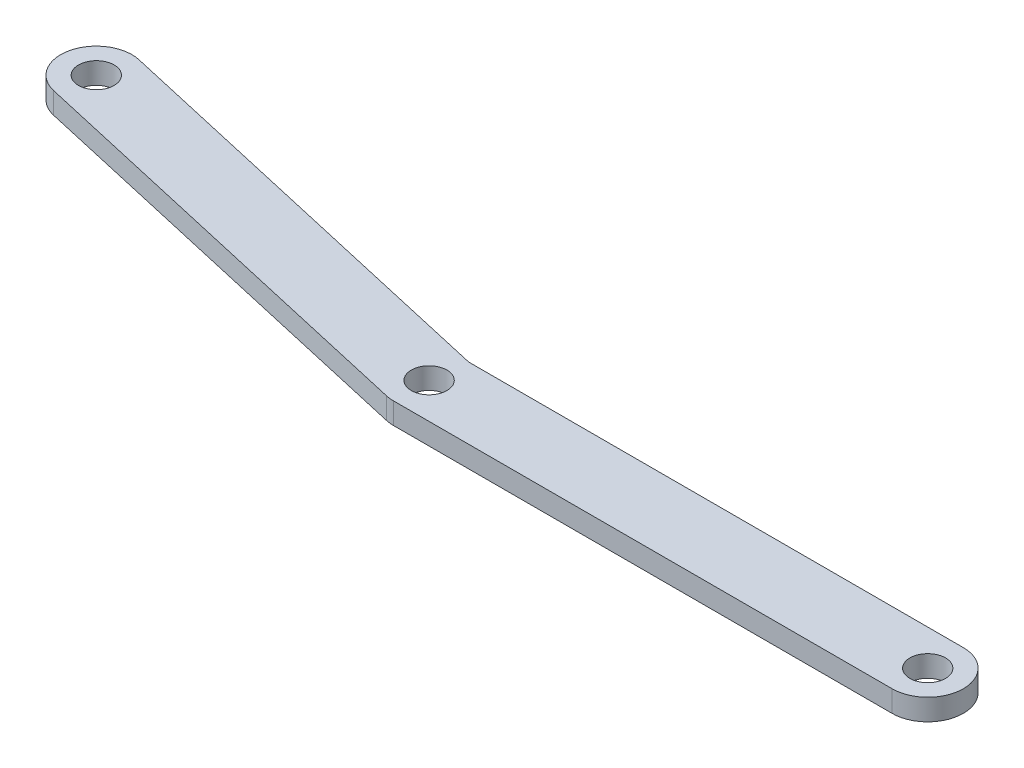
ISO-10303-21;
HEADER;
FILE_DESCRIPTION(('STEP AP214'),'2;1');
FILE_NAME('part.step','',(''),(''),'','','');
FILE_SCHEMA(('AUTOMOTIVE_DESIGN { 1 0 10303 214 1 1 1 1 }'));
ENDSEC;
DATA;
#1=APPLICATION_CONTEXT('core data for automotive mechanical design processes');
#2=APPLICATION_PROTOCOL_DEFINITION('international standard','automotive_design',2000,#1);
#3=PRODUCT_CONTEXT('',#1,'mechanical');
#4=PRODUCT('Part','Part','',(#3));
#5=PRODUCT_RELATED_PRODUCT_CATEGORY('part','',(#4));
#6=PRODUCT_DEFINITION_FORMATION('','',#4);
#7=PRODUCT_DEFINITION_CONTEXT('part definition',#1,'design');
#8=PRODUCT_DEFINITION('design','',#6,#7);
#9=PRODUCT_DEFINITION_SHAPE('','',#8);
#10=(LENGTH_UNIT() NAMED_UNIT(*) SI_UNIT(.MILLI.,.METRE.));
#11=(NAMED_UNIT(*) PLANE_ANGLE_UNIT() SI_UNIT($,.RADIAN.));
#12=(NAMED_UNIT(*) SI_UNIT($,.STERADIAN.) SOLID_ANGLE_UNIT());
#13=UNCERTAINTY_MEASURE_WITH_UNIT(LENGTH_MEASURE(1.E-05),#10,'distance_accuracy_value','');
#14=(GEOMETRIC_REPRESENTATION_CONTEXT(3) GLOBAL_UNCERTAINTY_ASSIGNED_CONTEXT((#13)) GLOBAL_UNIT_ASSIGNED_CONTEXT((#10,
#11,#12)) REPRESENTATION_CONTEXT('',''));
#15=CARTESIAN_POINT('',(0.,0.,0.));
#16=DIRECTION('',(0.,0.,1.));
#17=DIRECTION('',(1.,0.,0.));
#18=AXIS2_PLACEMENT_3D('',#15,#16,#17);
#19=CARTESIAN_POINT('',(-44.45,3.81,0.));
#20=DIRECTION('',(0.,-1.,0.));
#21=DIRECTION('',(0.,0.,-1.));
#22=AXIS2_PLACEMENT_3D('',#19,#20,#21);
#23=CYLINDRICAL_SURFACE('',#22,6.35);
#24=DIRECTION('',(0.,-1.,0.));
#25=VECTOR('',#24,1.);
#26=CARTESIAN_POINT('',(-44.45,3.81,6.35));
#27=LINE('',#26,#25);
#28=CARTESIAN_POINT('',(-44.45,3.81,6.35));
#29=VERTEX_POINT('',#28);
#30=CARTESIAN_POINT('',(-44.45,0.,6.35));
#31=VERTEX_POINT('',#30);
#32=EDGE_CURVE('E54',#29,#31,#27,.T.);
#33=ORIENTED_EDGE('',*,*,#32,.F.);
#34=CARTESIAN_POINT('',(-44.45,3.81,0.));
#35=DIRECTION('',(0.,1.,0.));
#36=DIRECTION('',(0.,0.,1.));
#37=AXIS2_PLACEMENT_3D('',#34,#35,#36);
#38=CIRCLE('',#37,6.35);
#39=CARTESIAN_POINT('',(-45.8568329598836,3.81,6.19219839984034));
#40=VERTEX_POINT('',#39);
#41=EDGE_CURVE('E118',#40,#29,#38,.T.);
#42=ORIENTED_EDGE('',*,*,#41,.F.);
#43=DIRECTION('',(0.,-1.,0.));
#44=VECTOR('',#43,1.);
#45=CARTESIAN_POINT('',(-45.8568329598836,3.81,6.19219839984034));
#46=LINE('',#45,#44);
#47=CARTESIAN_POINT('',(-45.8568329598836,0.,6.19219839984034));
#48=VERTEX_POINT('',#47);
#49=EDGE_CURVE('E143',#40,#48,#46,.T.);
#50=ORIENTED_EDGE('',*,*,#49,.T.);
#51=CARTESIAN_POINT('',(-44.45,0.,0.));
#52=DIRECTION('',(0.,1.,0.));
#53=DIRECTION('',(0.,0.,1.));
#54=AXIS2_PLACEMENT_3D('',#51,#52,#53);
#55=CIRCLE('',#54,6.35);
#56=EDGE_CURVE('E135',#48,#31,#55,.T.);
#57=ORIENTED_EDGE('',*,*,#56,.T.);
#58=EDGE_LOOP('',(#33,#42,#50,#57));
#59=FACE_BOUND('',#58,.T.);
#60=ADVANCED_FACE('F39',(#59),#23,.T.);
#61=CARTESIAN_POINT('',(-0.774939140762644,3.81,3.41090736728346));
#62=DIRECTION('',(-0.221548497619461,0.,0.975149354305565));
#63=DIRECTION('',(0.975149354305565,0.,0.221548497619461));
#64=AXIS2_PLACEMENT_3D('',#61,#62,#63);
#65=PLANE('',#64);
#66=DIRECTION('',(-0.975149354305565,0.,-0.221548497619461));
#67=VECTOR('',#66,1.);
#68=CARTESIAN_POINT('',(-0.774939140762644,3.81,3.41090736728346));
#69=LINE('',#68,#67);
#70=CARTESIAN_POINT('',(-43.7377333773181,3.81,-6.35));
#71=VERTEX_POINT('',#70);
#72=CARTESIAN_POINT('',(-119.826427198137,3.81,-23.6369271023967));
#73=VERTEX_POINT('',#72);
#74=EDGE_CURVE('E62',#71,#73,#69,.T.);
#75=ORIENTED_EDGE('',*,*,#74,.F.);
#76=DIRECTION('',(0.,-1.,0.));
#77=VECTOR('',#76,1.);
#78=CARTESIAN_POINT('',(-43.7377333773181,3.81,-6.35));
#79=LINE('',#78,#77);
#80=CARTESIAN_POINT('',(-43.7377333773181,0.,-6.35));
#81=VERTEX_POINT('',#80);
#82=EDGE_CURVE('E125',#71,#81,#79,.T.);
#83=ORIENTED_EDGE('',*,*,#82,.T.);
#84=DIRECTION('',(-0.975149354305565,0.,-0.221548497619461));
#85=VECTOR('',#84,1.);
#86=CARTESIAN_POINT('',(-0.774939140762644,0.,3.41090736728346));
#87=LINE('',#86,#85);
#88=CARTESIAN_POINT('',(-119.826427198137,0.,-23.6369271023967));
#89=VERTEX_POINT('',#88);
#90=EDGE_CURVE('E146',#81,#89,#87,.T.);
#91=ORIENTED_EDGE('',*,*,#90,.T.);
#92=DIRECTION('',(0.,-1.,0.));
#93=VECTOR('',#92,1.);
#94=CARTESIAN_POINT('',(-119.826427198137,3.81,-23.6369271023967));
#95=LINE('',#94,#93);
#96=EDGE_CURVE('E11',#73,#89,#95,.T.);
#97=ORIENTED_EDGE('',*,*,#96,.F.);
#98=EDGE_LOOP('',(#75,#83,#91,#97));
#99=FACE_BOUND('',#98,.T.);
#100=ADVANCED_FACE('F200',(#99),#65,.F.);
#101=CARTESIAN_POINT('',(-121.23326015802,3.81,-17.4447287025564));
#102=DIRECTION('',(0.,-1.,0.));
#103=DIRECTION('',(0.,0.,-1.));
#104=AXIS2_PLACEMENT_3D('',#101,#102,#103);
#105=CYLINDRICAL_SURFACE('',#104,6.35);
#106=CARTESIAN_POINT('',(-121.23326015802,0.,-17.4447287025564));
#107=DIRECTION('',(0.,1.,0.));
#108=DIRECTION('',(0.,0.,1.));
#109=AXIS2_PLACEMENT_3D('',#106,#107,#108);
#110=CIRCLE('',#109,6.35);
#111=CARTESIAN_POINT('',(-122.640093117904,0.,-11.252530302716));
#112=VERTEX_POINT('',#111);
#113=EDGE_CURVE('E148',#89,#112,#110,.T.);
#114=ORIENTED_EDGE('',*,*,#113,.T.);
#115=DIRECTION('',(0.,-1.,0.));
#116=VECTOR('',#115,1.);
#117=CARTESIAN_POINT('',(-122.640093117904,3.81,-11.252530302716));
#118=LINE('',#117,#116);
#119=CARTESIAN_POINT('',(-122.640093117904,3.81,-11.252530302716));
#120=VERTEX_POINT('',#119);
#121=EDGE_CURVE('E47',#120,#112,#118,.T.);
#122=ORIENTED_EDGE('',*,*,#121,.F.);
#123=CARTESIAN_POINT('',(-121.23326015802,3.81,-17.4447287025564));
#124=DIRECTION('',(0.,1.,0.));
#125=DIRECTION('',(0.,0.,1.));
#126=AXIS2_PLACEMENT_3D('',#123,#124,#125);
#127=CIRCLE('',#126,6.35);
#128=EDGE_CURVE('E137',#73,#120,#127,.T.);
#129=ORIENTED_EDGE('',*,*,#128,.F.);
#130=ORIENTED_EDGE('',*,*,#96,.T.);
#131=EDGE_LOOP('',(#114,#122,#129,#130));
#132=FACE_BOUND('',#131,.T.);
#133=ADVANCED_FACE('F162',(#132),#105,.T.);
#134=CARTESIAN_POINT('',(-3.5886050605298,3.81,15.7953041669641));
#135=DIRECTION('',(-0.221548497619461,0.,0.975149354305565));
#136=DIRECTION('',(0.975149354305565,0.,0.221548497619461));
#137=AXIS2_PLACEMENT_3D('',#134,#135,#136);
#138=PLANE('',#137);
#139=DIRECTION('',(-0.975149354305565,0.,-0.221548497619461));
#140=VECTOR('',#139,1.);
#141=CARTESIAN_POINT('',(-3.5886050605298,0.,15.7953041669641));
#142=LINE('',#141,#140);
#143=EDGE_CURVE('E151',#48,#112,#142,.T.);
#144=ORIENTED_EDGE('',*,*,#143,.F.);
#145=ORIENTED_EDGE('',*,*,#49,.F.);
#146=DIRECTION('',(-0.975149354305565,0.,-0.221548497619461));
#147=VECTOR('',#146,1.);
#148=CARTESIAN_POINT('',(-3.5886050605298,3.81,15.7953041669641));
#149=LINE('',#148,#147);
#150=EDGE_CURVE('E139',#40,#120,#149,.T.);
#151=ORIENTED_EDGE('',*,*,#150,.T.);
#152=ORIENTED_EDGE('',*,*,#121,.T.);
#153=EDGE_LOOP('',(#144,#145,#151,#152));
#154=FACE_BOUND('',#153,.T.);
#155=ADVANCED_FACE('F158',(#154),#138,.T.);
#156=CARTESIAN_POINT('',(-121.23326015802,3.81,-17.4447287025564));
#157=DIRECTION('',(0.,-1.,0.));
#158=DIRECTION('',(0.,0.,-1.));
#159=AXIS2_PLACEMENT_3D('',#156,#157,#158);
#160=CYLINDRICAL_SURFACE('',#159,3.175);
#161=CARTESIAN_POINT('',(-121.23326015802,3.81,-17.4447287025564));
#162=DIRECTION('',(0.,1.,0.));
#163=DIRECTION('',(0.,0.,1.));
#164=AXIS2_PLACEMENT_3D('',#161,#162,#163);
#165=CIRCLE('',#164,3.175);
#166=CARTESIAN_POINT('',(-121.23326015802,3.81,-20.6197287025564));
#167=VERTEX_POINT('',#166);
#168=EDGE_CURVE('E132',#167,#167,#165,.T.);
#169=CARTESIAN_POINT('',(-121.23326015802,0.,-17.4447287025564));
#170=DIRECTION('',(0.,1.,0.));
#171=DIRECTION('',(0.,0.,1.));
#172=AXIS2_PLACEMENT_3D('',#169,#170,#171);
#173=CIRCLE('',#172,3.175);
#174=CARTESIAN_POINT('',(-121.23326015802,0.,-20.6197287025564));
#175=VERTEX_POINT('',#174);
#176=EDGE_CURVE('E127',#175,#175,#173,.T.);
#177=CARTESIAN_POINT('',(-121.23326015802,3.81,-20.6197287025564));
#178=CARTESIAN_POINT('',(-121.23326015802,3.7703125,-20.6197287025564));
#179=CARTESIAN_POINT('',(-121.23326015802,3.730625,-20.6197287025564));
#180=CARTESIAN_POINT('',(-121.23326015802,3.65125,-20.6197287025564));
#181=CARTESIAN_POINT('',(-121.23326015802,3.6115625,-20.6197287025564));
#182=CARTESIAN_POINT('',(-121.23326015802,3.5321875,-20.6197287025564));
#183=CARTESIAN_POINT('',(-121.23326015802,3.4925,-20.6197287025564));
#184=CARTESIAN_POINT('',(-121.23326015802,3.413125,-20.6197287025564));
#185=CARTESIAN_POINT('',(-121.23326015802,3.3734375,-20.6197287025564));
#186=CARTESIAN_POINT('',(-121.23326015802,3.2940625,-20.6197287025564));
#187=CARTESIAN_POINT('',(-121.23326015802,3.254375,-20.6197287025564));
#188=CARTESIAN_POINT('',(-121.23326015802,3.175,-20.6197287025564));
#189=CARTESIAN_POINT('',(-121.23326015802,3.1353125,-20.6197287025564));
#190=CARTESIAN_POINT('',(-121.23326015802,3.0559375,-20.6197287025564));
#191=CARTESIAN_POINT('',(-121.23326015802,3.01625,-20.6197287025564));
#192=CARTESIAN_POINT('',(-121.23326015802,2.936875,-20.6197287025564));
#193=CARTESIAN_POINT('',(-121.23326015802,2.8971875,-20.6197287025564));
#194=CARTESIAN_POINT('',(-121.23326015802,2.8178125,-20.6197287025564));
#195=CARTESIAN_POINT('',(-121.23326015802,2.778125,-20.6197287025564));
#196=CARTESIAN_POINT('',(-121.23326015802,2.69875,-20.6197287025564));
#197=CARTESIAN_POINT('',(-121.23326015802,2.6590625,-20.6197287025564));
#198=CARTESIAN_POINT('',(-121.23326015802,2.5796875,-20.6197287025564));
#199=CARTESIAN_POINT('',(-121.23326015802,2.54,-20.6197287025564));
#200=CARTESIAN_POINT('',(-121.23326015802,2.460625,-20.6197287025564));
#201=CARTESIAN_POINT('',(-121.23326015802,2.4209375,-20.6197287025564));
#202=CARTESIAN_POINT('',(-121.23326015802,2.3415625,-20.6197287025564));
#203=CARTESIAN_POINT('',(-121.23326015802,2.301875,-20.6197287025564));
#204=CARTESIAN_POINT('',(-121.23326015802,2.2225,-20.6197287025564));
#205=CARTESIAN_POINT('',(-121.23326015802,2.1828125,-20.6197287025564));
#206=CARTESIAN_POINT('',(-121.23326015802,2.1034375,-20.6197287025564));
#207=CARTESIAN_POINT('',(-121.23326015802,2.06375,-20.6197287025564));
#208=CARTESIAN_POINT('',(-121.23326015802,1.984375,-20.6197287025564));
#209=CARTESIAN_POINT('',(-121.23326015802,1.9446875,-20.6197287025564));
#210=CARTESIAN_POINT('',(-121.23326015802,1.8653125,-20.6197287025564));
#211=CARTESIAN_POINT('',(-121.23326015802,1.825625,-20.6197287025564));
#212=CARTESIAN_POINT('',(-121.23326015802,1.74625,-20.6197287025564));
#213=CARTESIAN_POINT('',(-121.23326015802,1.7065625,-20.6197287025564));
#214=CARTESIAN_POINT('',(-121.23326015802,1.6271875,-20.6197287025564));
#215=CARTESIAN_POINT('',(-121.23326015802,1.5875,-20.6197287025564));
#216=CARTESIAN_POINT('',(-121.23326015802,1.508125,-20.6197287025564));
#217=CARTESIAN_POINT('',(-121.23326015802,1.4684375,-20.6197287025564));
#218=CARTESIAN_POINT('',(-121.23326015802,1.3890625,-20.6197287025564));
#219=CARTESIAN_POINT('',(-121.23326015802,1.349375,-20.6197287025564));
#220=CARTESIAN_POINT('',(-121.23326015802,1.27,-20.6197287025564));
#221=CARTESIAN_POINT('',(-121.23326015802,1.2303125,-20.6197287025564));
#222=CARTESIAN_POINT('',(-121.23326015802,1.1509375,-20.6197287025564));
#223=CARTESIAN_POINT('',(-121.23326015802,1.11125,-20.6197287025564));
#224=CARTESIAN_POINT('',(-121.23326015802,1.031875,-20.6197287025564));
#225=CARTESIAN_POINT('',(-121.23326015802,0.9921875,-20.6197287025564));
#226=CARTESIAN_POINT('',(-121.23326015802,0.9128125,-20.6197287025564));
#227=CARTESIAN_POINT('',(-121.23326015802,0.873125,-20.6197287025564));
#228=CARTESIAN_POINT('',(-121.23326015802,0.79375,-20.6197287025564));
#229=CARTESIAN_POINT('',(-121.23326015802,0.7540625,-20.6197287025564));
#230=CARTESIAN_POINT('',(-121.23326015802,0.6746875,-20.6197287025564));
#231=CARTESIAN_POINT('',(-121.23326015802,0.635,-20.6197287025564));
#232=CARTESIAN_POINT('',(-121.23326015802,0.555625,-20.6197287025564));
#233=CARTESIAN_POINT('',(-121.23326015802,0.5159375,-20.6197287025564));
#234=CARTESIAN_POINT('',(-121.23326015802,0.4365625,-20.6197287025564));
#235=CARTESIAN_POINT('',(-121.23326015802,0.396875,-20.6197287025564));
#236=CARTESIAN_POINT('',(-121.23326015802,0.3175,-20.6197287025564));
#237=CARTESIAN_POINT('',(-121.23326015802,0.2778125,-20.6197287025564));
#238=CARTESIAN_POINT('',(-121.23326015802,0.1984375,-20.6197287025564));
#239=CARTESIAN_POINT('',(-121.23326015802,0.15875,-20.6197287025564));
#240=CARTESIAN_POINT('',(-121.23326015802,0.0793749999999999,-20.6197287025564));
#241=CARTESIAN_POINT('',(-121.23326015802,0.0396874999999999,-20.6197287025564));
#242=CARTESIAN_POINT('',(-121.23326015802,0.,-20.6197287025564));
#243=B_SPLINE_CURVE_WITH_KNOTS('',3,(#177,#178,#179,#180,#181,#182,#183,#184,#185,#186,#187,
#188,#189,#190,#191,#192,#193,#194,#195,#196,#197,#198,#199,#200,#201,#202,#203,#204,#205,#206,
#207,#208,#209,#210,#211,#212,#213,#214,#215,#216,#217,#218,#219,#220,#221,#222,#223,#224,#225,
#226,#227,#228,#229,#230,#231,#232,#233,#234,#235,#236,#237,#238,#239,#240,#241,#242),
.UNSPECIFIED.,.F.,.F.,(4,2,2,2,2,2,2,2,2,2,2,2,2,2,2,2,2,2,2,2,2,2,2,2,2,2,2,2,2,2,2,2,4),(0.,
0.1190625,0.238125,0.3571875,0.47625,0.595312499999999,0.714375,0.833437499999999,
0.952499999999999,1.0715625,1.190625,1.3096875,1.42875,1.5478125,1.666875,1.7859375,1.905,
2.0240625,2.143125,2.2621875,2.38125,2.5003125,2.619375,2.7384375,2.8575,2.9765625,3.095625,
3.2146875,3.33375,3.4528125,3.571875,3.6909375,3.81),.UNSPECIFIED.);
#244=EDGE_CURVE('BSEAM41',#167,#175,#243,.T.);
#245=ORIENTED_EDGE('',*,*,#168,.T.);
#246=ORIENTED_EDGE('',*,*,#176,.F.);
#247=ORIENTED_EDGE('',*,*,#244,.T.);
#248=ORIENTED_EDGE('',*,*,#244,.F.);
#249=EDGE_LOOP('',(#245,#247,#246,#248));
#250=FACE_BOUND('',#249,.T.);
#251=ADVANCED_FACE('F41',(#250),#160,.F.);
#252=CARTESIAN_POINT('',(0.,3.81,0.));
#253=DIRECTION('',(0.,1.,0.));
#254=DIRECTION('',(0.,0.,1.));
#255=AXIS2_PLACEMENT_3D('',#252,#253,#254);
#256=PLANE('',#255);
#257=CARTESIAN_POINT('',(-44.45,3.81,0.));
#258=DIRECTION('',(0.,1.,0.));
#259=DIRECTION('',(0.,0.,1.));
#260=AXIS2_PLACEMENT_3D('',#257,#258,#259);
#261=CIRCLE('',#260,3.175);
#262=CARTESIAN_POINT('',(-44.45,3.81,3.175));
#263=VERTEX_POINT('',#262);
#264=EDGE_CURVE('E177',#263,#263,#261,.T.);
#265=ORIENTED_EDGE('',*,*,#264,.F.);
#266=EDGE_LOOP('',(#265));
#267=FACE_BOUND('',#266,.T.);
#268=DIRECTION('',(1.,0.,0.));
#269=VECTOR('',#268,1.);
#270=CARTESIAN_POINT('',(0.,3.81,-6.35000000000001));
#271=LINE('',#270,#269);
#272=CARTESIAN_POINT('',(44.45,3.81,-6.35000000000002));
#273=VERTEX_POINT('',#272);
#274=EDGE_CURVE('E111',#71,#273,#271,.T.);
#275=ORIENTED_EDGE('',*,*,#274,.F.);
#276=ORIENTED_EDGE('',*,*,#74,.T.);
#277=ORIENTED_EDGE('',*,*,#128,.T.);
#278=ORIENTED_EDGE('',*,*,#150,.F.);
#279=ORIENTED_EDGE('',*,*,#41,.T.);
#280=DIRECTION('',(1.,0.,0.));
#281=VECTOR('',#280,1.);
#282=CARTESIAN_POINT('',(0.,3.81,6.34999999999999));
#283=LINE('',#282,#281);
#284=CARTESIAN_POINT('',(44.45,3.81,6.34999999999998));
#285=VERTEX_POINT('',#284);
#286=EDGE_CURVE('E112',#29,#285,#283,.T.);
#287=ORIENTED_EDGE('',*,*,#286,.T.);
#288=CARTESIAN_POINT('',(44.45,3.81,0.));
#289=DIRECTION('',(0.,1.,0.));
#290=DIRECTION('',(0.,0.,1.));
#291=AXIS2_PLACEMENT_3D('',#288,#289,#290);
#292=CIRCLE('',#291,6.35);
#293=EDGE_CURVE('E100',#285,#273,#292,.T.);
#294=ORIENTED_EDGE('',*,*,#293,.T.);
#295=EDGE_LOOP('',(#275,#276,#277,#278,#279,#287,#294));
#296=FACE_BOUND('',#295,.T.);
#297=ORIENTED_EDGE('',*,*,#168,.F.);
#298=EDGE_LOOP('',(#297));
#299=FACE_BOUND('',#298,.T.);
#300=CARTESIAN_POINT('',(44.45,3.81,0.));
#301=DIRECTION('',(0.,1.,0.));
#302=DIRECTION('',(0.,0.,1.));
#303=AXIS2_PLACEMENT_3D('',#300,#301,#302);
#304=CIRCLE('',#303,3.175);
#305=CARTESIAN_POINT('',(44.45,3.81,-3.17500000000001));
#306=VERTEX_POINT('',#305);
#307=EDGE_CURVE('E120',#306,#306,#304,.T.);
#308=ORIENTED_EDGE('',*,*,#307,.F.);
#309=EDGE_LOOP('',(#308));
#310=FACE_BOUND('',#309,.T.);
#311=ADVANCED_FACE('F115',(#267,#296,#299,#310),#256,.T.);
#312=CARTESIAN_POINT('',(0.,0.,0.));
#313=DIRECTION('',(0.,1.,0.));
#314=DIRECTION('',(0.,0.,1.));
#315=AXIS2_PLACEMENT_3D('',#312,#313,#314);
#316=PLANE('',#315);
#317=CARTESIAN_POINT('',(-44.45,0.,0.));
#318=DIRECTION('',(0.,1.,0.));
#319=DIRECTION('',(0.,0.,1.));
#320=AXIS2_PLACEMENT_3D('',#317,#318,#319);
#321=CIRCLE('',#320,3.175);
#322=CARTESIAN_POINT('',(-44.45,0.,3.175));
#323=VERTEX_POINT('',#322);
#324=EDGE_CURVE('E183',#323,#323,#321,.T.);
#325=ORIENTED_EDGE('',*,*,#324,.T.);
#326=EDGE_LOOP('',(#325));
#327=FACE_BOUND('',#326,.T.);
#328=ORIENTED_EDGE('',*,*,#90,.F.);
#329=DIRECTION('',(1.,0.,0.));
#330=VECTOR('',#329,1.);
#331=CARTESIAN_POINT('',(0.,0.,-6.35000000000001));
#332=LINE('',#331,#330);
#333=CARTESIAN_POINT('',(44.45,0.,-6.35000000000002));
#334=VERTEX_POINT('',#333);
#335=EDGE_CURVE('E170',#81,#334,#332,.T.);
#336=ORIENTED_EDGE('',*,*,#335,.T.);
#337=CARTESIAN_POINT('',(44.45,0.,0.));
#338=DIRECTION('',(0.,1.,0.));
#339=DIRECTION('',(0.,0.,1.));
#340=AXIS2_PLACEMENT_3D('',#337,#338,#339);
#341=CIRCLE('',#340,6.35);
#342=CARTESIAN_POINT('',(44.45,0.,6.34999999999998));
#343=VERTEX_POINT('',#342);
#344=EDGE_CURVE('E172',#343,#334,#341,.T.);
#345=ORIENTED_EDGE('',*,*,#344,.F.);
#346=DIRECTION('',(1.,0.,0.));
#347=VECTOR('',#346,1.);
#348=CARTESIAN_POINT('',(0.,0.,6.34999999999999));
#349=LINE('',#348,#347);
#350=EDGE_CURVE('E124',#31,#343,#349,.T.);
#351=ORIENTED_EDGE('',*,*,#350,.F.);
#352=ORIENTED_EDGE('',*,*,#56,.F.);
#353=ORIENTED_EDGE('',*,*,#143,.T.);
#354=ORIENTED_EDGE('',*,*,#113,.F.);
#355=EDGE_LOOP('',(#328,#336,#345,#351,#352,#353,#354));
#356=FACE_BOUND('',#355,.T.);
#357=ORIENTED_EDGE('',*,*,#176,.T.);
#358=EDGE_LOOP('',(#357));
#359=FACE_BOUND('',#358,.T.);
#360=CARTESIAN_POINT('',(44.45,0.,0.));
#361=DIRECTION('',(0.,1.,0.));
#362=DIRECTION('',(0.,0.,1.));
#363=AXIS2_PLACEMENT_3D('',#360,#361,#362);
#364=CIRCLE('',#363,3.175);
#365=CARTESIAN_POINT('',(44.45,0.,-3.17500000000001));
#366=VERTEX_POINT('',#365);
#367=EDGE_CURVE('E175',#366,#366,#364,.T.);
#368=ORIENTED_EDGE('',*,*,#367,.T.);
#369=EDGE_LOOP('',(#368));
#370=FACE_BOUND('',#369,.T.);
#371=ADVANCED_FACE('F166',(#327,#356,#359,#370),#316,.F.);
#372=CARTESIAN_POINT('',(0.,3.81,-6.35000000000001));
#373=DIRECTION('',(0.,0.,-1.));
#374=DIRECTION('',(-1.,0.,0.));
#375=AXIS2_PLACEMENT_3D('',#372,#373,#374);
#376=PLANE('',#375);
#377=ORIENTED_EDGE('',*,*,#82,.F.);
#378=ORIENTED_EDGE('',*,*,#274,.T.);
#379=DIRECTION('',(0.,-1.,0.));
#380=VECTOR('',#379,1.);
#381=CARTESIAN_POINT('',(44.45,3.81,-6.35000000000002));
#382=LINE('',#381,#380);
#383=EDGE_CURVE('E108',#273,#334,#382,.T.);
#384=ORIENTED_EDGE('',*,*,#383,.T.);
#385=ORIENTED_EDGE('',*,*,#335,.F.);
#386=EDGE_LOOP('',(#377,#378,#384,#385));
#387=FACE_BOUND('',#386,.T.);
#388=ADVANCED_FACE('F238',(#387),#376,.T.);
#389=CARTESIAN_POINT('',(0.,3.81,6.34999999999999));
#390=DIRECTION('',(0.,0.,-1.));
#391=DIRECTION('',(-1.,0.,0.));
#392=AXIS2_PLACEMENT_3D('',#389,#390,#391);
#393=PLANE('',#392);
#394=ORIENTED_EDGE('',*,*,#350,.T.);
#395=DIRECTION('',(0.,-1.,0.));
#396=VECTOR('',#395,1.);
#397=CARTESIAN_POINT('',(44.45,3.81,6.34999999999998));
#398=LINE('',#397,#396);
#399=EDGE_CURVE('E105',#285,#343,#398,.T.);
#400=ORIENTED_EDGE('',*,*,#399,.F.);
#401=ORIENTED_EDGE('',*,*,#286,.F.);
#402=ORIENTED_EDGE('',*,*,#32,.T.);
#403=EDGE_LOOP('',(#394,#400,#401,#402));
#404=FACE_BOUND('',#403,.T.);
#405=ADVANCED_FACE('F122',(#404),#393,.F.);
#406=CARTESIAN_POINT('',(44.45,3.81,0.));
#407=DIRECTION('',(0.,-1.,0.));
#408=DIRECTION('',(0.,0.,-1.));
#409=AXIS2_PLACEMENT_3D('',#406,#407,#408);
#410=CYLINDRICAL_SURFACE('',#409,6.35);
#411=ORIENTED_EDGE('',*,*,#344,.T.);
#412=ORIENTED_EDGE('',*,*,#383,.F.);
#413=ORIENTED_EDGE('',*,*,#293,.F.);
#414=ORIENTED_EDGE('',*,*,#399,.T.);
#415=EDGE_LOOP('',(#411,#412,#413,#414));
#416=FACE_BOUND('',#415,.T.);
#417=ADVANCED_FACE('F103',(#416),#410,.T.);
#418=CARTESIAN_POINT('',(44.45,3.81,0.));
#419=DIRECTION('',(0.,-1.,0.));
#420=DIRECTION('',(0.,0.,-1.));
#421=AXIS2_PLACEMENT_3D('',#418,#419,#420);
#422=CYLINDRICAL_SURFACE('',#421,3.175);
#423=CARTESIAN_POINT('',(44.45,3.81,-3.17500000000001));
#424=CARTESIAN_POINT('',(44.45,3.7703125,-3.17500000000001));
#425=CARTESIAN_POINT('',(44.45,3.730625,-3.17500000000001));
#426=CARTESIAN_POINT('',(44.45,3.65125,-3.17500000000001));
#427=CARTESIAN_POINT('',(44.45,3.6115625,-3.17500000000001));
#428=CARTESIAN_POINT('',(44.45,3.5321875,-3.17500000000001));
#429=CARTESIAN_POINT('',(44.45,3.4925,-3.17500000000001));
#430=CARTESIAN_POINT('',(44.45,3.413125,-3.17500000000001));
#431=CARTESIAN_POINT('',(44.45,3.3734375,-3.17500000000001));
#432=CARTESIAN_POINT('',(44.45,3.2940625,-3.17500000000001));
#433=CARTESIAN_POINT('',(44.45,3.254375,-3.17500000000001));
#434=CARTESIAN_POINT('',(44.45,3.175,-3.17500000000001));
#435=CARTESIAN_POINT('',(44.45,3.1353125,-3.17500000000001));
#436=CARTESIAN_POINT('',(44.45,3.0559375,-3.17500000000001));
#437=CARTESIAN_POINT('',(44.45,3.01625,-3.17500000000001));
#438=CARTESIAN_POINT('',(44.45,2.936875,-3.17500000000001));
#439=CARTESIAN_POINT('',(44.45,2.8971875,-3.17500000000001));
#440=CARTESIAN_POINT('',(44.45,2.8178125,-3.17500000000001));
#441=CARTESIAN_POINT('',(44.45,2.778125,-3.17500000000001));
#442=CARTESIAN_POINT('',(44.45,2.69875,-3.17500000000001));
#443=CARTESIAN_POINT('',(44.45,2.6590625,-3.17500000000001));
#444=CARTESIAN_POINT('',(44.45,2.5796875,-3.17500000000001));
#445=CARTESIAN_POINT('',(44.45,2.54,-3.17500000000001));
#446=CARTESIAN_POINT('',(44.45,2.460625,-3.17500000000001));
#447=CARTESIAN_POINT('',(44.45,2.4209375,-3.17500000000001));
#448=CARTESIAN_POINT('',(44.45,2.3415625,-3.17500000000001));
#449=CARTESIAN_POINT('',(44.45,2.301875,-3.17500000000001));
#450=CARTESIAN_POINT('',(44.45,2.2225,-3.17500000000001));
#451=CARTESIAN_POINT('',(44.45,2.1828125,-3.17500000000001));
#452=CARTESIAN_POINT('',(44.45,2.1034375,-3.17500000000001));
#453=CARTESIAN_POINT('',(44.45,2.06375,-3.17500000000001));
#454=CARTESIAN_POINT('',(44.45,1.984375,-3.17500000000001));
#455=CARTESIAN_POINT('',(44.45,1.9446875,-3.17500000000001));
#456=CARTESIAN_POINT('',(44.45,1.8653125,-3.17500000000001));
#457=CARTESIAN_POINT('',(44.45,1.825625,-3.17500000000001));
#458=CARTESIAN_POINT('',(44.45,1.74625,-3.17500000000001));
#459=CARTESIAN_POINT('',(44.45,1.7065625,-3.17500000000001));
#460=CARTESIAN_POINT('',(44.45,1.6271875,-3.17500000000001));
#461=CARTESIAN_POINT('',(44.45,1.5875,-3.17500000000001));
#462=CARTESIAN_POINT('',(44.45,1.508125,-3.17500000000001));
#463=CARTESIAN_POINT('',(44.45,1.4684375,-3.17500000000001));
#464=CARTESIAN_POINT('',(44.45,1.3890625,-3.17500000000001));
#465=CARTESIAN_POINT('',(44.45,1.349375,-3.17500000000001));
#466=CARTESIAN_POINT('',(44.45,1.27,-3.17500000000001));
#467=CARTESIAN_POINT('',(44.45,1.2303125,-3.17500000000001));
#468=CARTESIAN_POINT('',(44.45,1.1509375,-3.17500000000001));
#469=CARTESIAN_POINT('',(44.45,1.11125,-3.17500000000001));
#470=CARTESIAN_POINT('',(44.45,1.031875,-3.17500000000001));
#471=CARTESIAN_POINT('',(44.45,0.9921875,-3.17500000000001));
#472=CARTESIAN_POINT('',(44.45,0.9128125,-3.17500000000001));
#473=CARTESIAN_POINT('',(44.45,0.873125,-3.17500000000001));
#474=CARTESIAN_POINT('',(44.45,0.79375,-3.17500000000001));
#475=CARTESIAN_POINT('',(44.45,0.7540625,-3.17500000000001));
#476=CARTESIAN_POINT('',(44.45,0.6746875,-3.17500000000001));
#477=CARTESIAN_POINT('',(44.45,0.635,-3.17500000000001));
#478=CARTESIAN_POINT('',(44.45,0.555625,-3.17500000000001));
#479=CARTESIAN_POINT('',(44.45,0.5159375,-3.17500000000001));
#480=CARTESIAN_POINT('',(44.45,0.4365625,-3.17500000000001));
#481=CARTESIAN_POINT('',(44.45,0.396875,-3.17500000000001));
#482=CARTESIAN_POINT('',(44.45,0.3175,-3.17500000000001));
#483=CARTESIAN_POINT('',(44.45,0.2778125,-3.17500000000001));
#484=CARTESIAN_POINT('',(44.45,0.1984375,-3.17500000000001));
#485=CARTESIAN_POINT('',(44.45,0.15875,-3.17500000000001));
#486=CARTESIAN_POINT('',(44.45,0.0793749999999999,-3.17500000000001));
#487=CARTESIAN_POINT('',(44.45,0.0396874999999999,-3.17500000000001));
#488=CARTESIAN_POINT('',(44.45,0.,-3.17500000000001));
#489=B_SPLINE_CURVE_WITH_KNOTS('',3,(#423,#424,#425,#426,#427,#428,#429,#430,#431,#432,#433,
#434,#435,#436,#437,#438,#439,#440,#441,#442,#443,#444,#445,#446,#447,#448,#449,#450,#451,#452,
#453,#454,#455,#456,#457,#458,#459,#460,#461,#462,#463,#464,#465,#466,#467,#468,#469,#470,#471,
#472,#473,#474,#475,#476,#477,#478,#479,#480,#481,#482,#483,#484,#485,#486,#487,#488),
.UNSPECIFIED.,.F.,.F.,(4,2,2,2,2,2,2,2,2,2,2,2,2,2,2,2,2,2,2,2,2,2,2,2,2,2,2,2,2,2,2,2,4),(0.,
0.1190625,0.238125,0.3571875,0.47625,0.595312499999999,0.714375,0.833437499999999,
0.952499999999999,1.0715625,1.190625,1.3096875,1.42875,1.5478125,1.666875,1.7859375,1.905,
2.0240625,2.143125,2.2621875,2.38125,2.5003125,2.619375,2.7384375,2.8575,2.9765625,3.095625,
3.2146875,3.33375,3.4528125,3.571875,3.6909375,3.81),.UNSPECIFIED.);
#490=EDGE_CURVE('BSEAM190',#306,#366,#489,.T.);
#491=ORIENTED_EDGE('',*,*,#307,.T.);
#492=ORIENTED_EDGE('',*,*,#367,.F.);
#493=ORIENTED_EDGE('',*,*,#490,.T.);
#494=ORIENTED_EDGE('',*,*,#490,.F.);
#495=EDGE_LOOP('',(#491,#493,#492,#494));
#496=FACE_BOUND('',#495,.T.);
#497=ADVANCED_FACE('F190',(#496),#422,.F.);
#498=CARTESIAN_POINT('',(-44.45,0.,0.));
#499=DIRECTION('',(0.,1.,0.));
#500=DIRECTION('',(0.,0.,1.));
#501=AXIS2_PLACEMENT_3D('',#498,#499,#500);
#502=CYLINDRICAL_SURFACE('',#501,3.175);
#503=CARTESIAN_POINT('',(-44.45,3.81,3.175));
#504=CARTESIAN_POINT('',(-44.45,3.7703125,3.175));
#505=CARTESIAN_POINT('',(-44.45,3.730625,3.175));
#506=CARTESIAN_POINT('',(-44.45,3.65125,3.175));
#507=CARTESIAN_POINT('',(-44.45,3.6115625,3.175));
#508=CARTESIAN_POINT('',(-44.45,3.5321875,3.175));
#509=CARTESIAN_POINT('',(-44.45,3.4925,3.175));
#510=CARTESIAN_POINT('',(-44.45,3.413125,3.175));
#511=CARTESIAN_POINT('',(-44.45,3.3734375,3.175));
#512=CARTESIAN_POINT('',(-44.45,3.2940625,3.175));
#513=CARTESIAN_POINT('',(-44.45,3.254375,3.175));
#514=CARTESIAN_POINT('',(-44.45,3.175,3.175));
#515=CARTESIAN_POINT('',(-44.45,3.1353125,3.175));
#516=CARTESIAN_POINT('',(-44.45,3.0559375,3.175));
#517=CARTESIAN_POINT('',(-44.45,3.01625,3.175));
#518=CARTESIAN_POINT('',(-44.45,2.936875,3.175));
#519=CARTESIAN_POINT('',(-44.45,2.8971875,3.175));
#520=CARTESIAN_POINT('',(-44.45,2.8178125,3.175));
#521=CARTESIAN_POINT('',(-44.45,2.778125,3.175));
#522=CARTESIAN_POINT('',(-44.45,2.69875,3.175));
#523=CARTESIAN_POINT('',(-44.45,2.6590625,3.175));
#524=CARTESIAN_POINT('',(-44.45,2.5796875,3.175));
#525=CARTESIAN_POINT('',(-44.45,2.54,3.175));
#526=CARTESIAN_POINT('',(-44.45,2.460625,3.175));
#527=CARTESIAN_POINT('',(-44.45,2.4209375,3.175));
#528=CARTESIAN_POINT('',(-44.45,2.3415625,3.175));
#529=CARTESIAN_POINT('',(-44.45,2.301875,3.175));
#530=CARTESIAN_POINT('',(-44.45,2.2225,3.175));
#531=CARTESIAN_POINT('',(-44.45,2.1828125,3.175));
#532=CARTESIAN_POINT('',(-44.45,2.1034375,3.175));
#533=CARTESIAN_POINT('',(-44.45,2.06375,3.175));
#534=CARTESIAN_POINT('',(-44.45,1.984375,3.175));
#535=CARTESIAN_POINT('',(-44.45,1.9446875,3.175));
#536=CARTESIAN_POINT('',(-44.45,1.8653125,3.175));
#537=CARTESIAN_POINT('',(-44.45,1.825625,3.175));
#538=CARTESIAN_POINT('',(-44.45,1.74625,3.175));
#539=CARTESIAN_POINT('',(-44.45,1.7065625,3.175));
#540=CARTESIAN_POINT('',(-44.45,1.6271875,3.175));
#541=CARTESIAN_POINT('',(-44.45,1.5875,3.175));
#542=CARTESIAN_POINT('',(-44.45,1.508125,3.175));
#543=CARTESIAN_POINT('',(-44.45,1.4684375,3.175));
#544=CARTESIAN_POINT('',(-44.45,1.3890625,3.175));
#545=CARTESIAN_POINT('',(-44.45,1.349375,3.175));
#546=CARTESIAN_POINT('',(-44.45,1.27,3.175));
#547=CARTESIAN_POINT('',(-44.45,1.2303125,3.175));
#548=CARTESIAN_POINT('',(-44.45,1.1509375,3.175));
#549=CARTESIAN_POINT('',(-44.45,1.11125,3.175));
#550=CARTESIAN_POINT('',(-44.45,1.031875,3.175));
#551=CARTESIAN_POINT('',(-44.45,0.9921875,3.175));
#552=CARTESIAN_POINT('',(-44.45,0.9128125,3.175));
#553=CARTESIAN_POINT('',(-44.45,0.873125,3.175));
#554=CARTESIAN_POINT('',(-44.45,0.79375,3.175));
#555=CARTESIAN_POINT('',(-44.45,0.7540625,3.175));
#556=CARTESIAN_POINT('',(-44.45,0.6746875,3.175));
#557=CARTESIAN_POINT('',(-44.45,0.635,3.175));
#558=CARTESIAN_POINT('',(-44.45,0.555625,3.175));
#559=CARTESIAN_POINT('',(-44.45,0.5159375,3.175));
#560=CARTESIAN_POINT('',(-44.45,0.4365625,3.175));
#561=CARTESIAN_POINT('',(-44.45,0.396875,3.175));
#562=CARTESIAN_POINT('',(-44.45,0.3175,3.175));
#563=CARTESIAN_POINT('',(-44.45,0.2778125,3.175));
#564=CARTESIAN_POINT('',(-44.45,0.1984375,3.175));
#565=CARTESIAN_POINT('',(-44.45,0.15875,3.175));
#566=CARTESIAN_POINT('',(-44.45,0.0793749999999998,3.175));
#567=CARTESIAN_POINT('',(-44.45,0.0396874999999999,3.175));
#568=CARTESIAN_POINT('',(-44.45,0.,3.175));
#569=B_SPLINE_CURVE_WITH_KNOTS('',3,(#503,#504,#505,#506,#507,#508,#509,#510,#511,#512,#513,
#514,#515,#516,#517,#518,#519,#520,#521,#522,#523,#524,#525,#526,#527,#528,#529,#530,#531,#532,
#533,#534,#535,#536,#537,#538,#539,#540,#541,#542,#543,#544,#545,#546,#547,#548,#549,#550,#551,
#552,#553,#554,#555,#556,#557,#558,#559,#560,#561,#562,#563,#564,#565,#566,#567,#568),
.UNSPECIFIED.,.F.,.F.,(4,2,2,2,2,2,2,2,2,2,2,2,2,2,2,2,2,2,2,2,2,2,2,2,2,2,2,2,2,2,2,2,4),(0.,
0.1190625,0.238125,0.3571875,0.47625,0.5953125,0.714375,0.8334375,0.9525,1.0715625,1.190625,
1.3096875,1.42875,1.5478125,1.666875,1.7859375,1.905,2.0240625,2.143125,2.2621875,2.38125,
2.5003125,2.619375,2.7384375,2.8575,2.9765625,3.095625,3.2146875,3.33375,3.4528125,3.571875,
3.6909375,3.81),.UNSPECIFIED.);
#570=EDGE_CURVE('BSEAM188',#263,#323,#569,.T.);
#571=ORIENTED_EDGE('',*,*,#264,.T.);
#572=ORIENTED_EDGE('',*,*,#324,.F.);
#573=ORIENTED_EDGE('',*,*,#570,.T.);
#574=ORIENTED_EDGE('',*,*,#570,.F.);
#575=EDGE_LOOP('',(#571,#573,#572,#574));
#576=FACE_BOUND('',#575,.T.);
#577=ADVANCED_FACE('F188',(#576),#502,.F.);
#578=CLOSED_SHELL('',(#60,#100,#133,#155,#251,#311,#371,#388,#405,#417,#497,#577));
#579=MANIFOLD_SOLID_BREP('B2',#578);
#580=ADVANCED_BREP_SHAPE_REPRESENTATION('',(#18,#579),#14);
#581=SHAPE_DEFINITION_REPRESENTATION(#9,#580);
ENDSEC;
END-ISO-10303-21;
